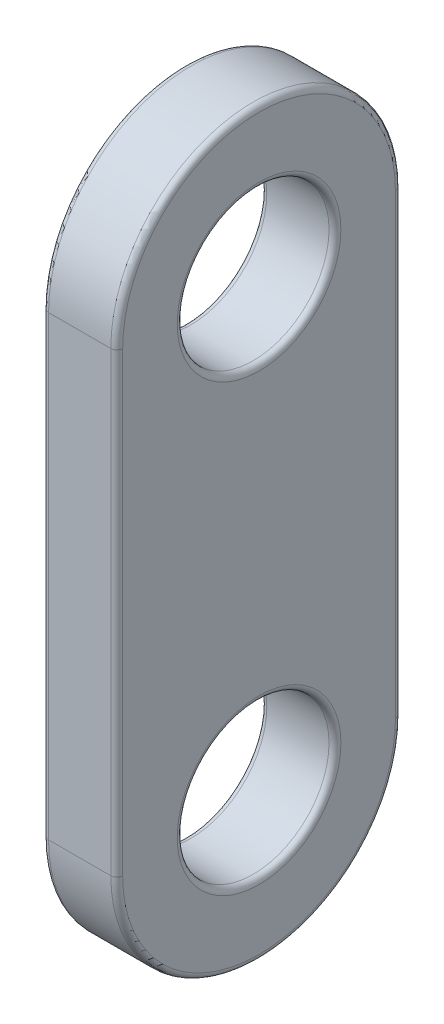
ISO-10303-21;
HEADER;
FILE_DESCRIPTION(('STEP AP214'),'2;1');
FILE_NAME('part.step','',(''),(''),'','','');
FILE_SCHEMA(('AUTOMOTIVE_DESIGN { 1 0 10303 214 1 1 1 1 }'));
ENDSEC;
DATA;
#1=APPLICATION_CONTEXT('core data for automotive mechanical design processes');
#2=APPLICATION_PROTOCOL_DEFINITION('international standard','automotive_design',2000,#1);
#3=PRODUCT_CONTEXT('',#1,'mechanical');
#4=PRODUCT('Part','Part','',(#3));
#5=PRODUCT_RELATED_PRODUCT_CATEGORY('part','',(#4));
#6=PRODUCT_DEFINITION_FORMATION('','',#4);
#7=PRODUCT_DEFINITION_CONTEXT('part definition',#1,'design');
#8=PRODUCT_DEFINITION('design','',#6,#7);
#9=PRODUCT_DEFINITION_SHAPE('','',#8);
#10=(LENGTH_UNIT() NAMED_UNIT(*) SI_UNIT(.MILLI.,.METRE.));
#11=(NAMED_UNIT(*) PLANE_ANGLE_UNIT() SI_UNIT($,.RADIAN.));
#12=(NAMED_UNIT(*) SI_UNIT($,.STERADIAN.) SOLID_ANGLE_UNIT());
#13=UNCERTAINTY_MEASURE_WITH_UNIT(LENGTH_MEASURE(1.E-05),#10,'distance_accuracy_value','');
#14=(GEOMETRIC_REPRESENTATION_CONTEXT(3) GLOBAL_UNCERTAINTY_ASSIGNED_CONTEXT((#13)) GLOBAL_UNIT_ASSIGNED_CONTEXT((#10,
#11,#12)) REPRESENTATION_CONTEXT('',''));
#15=CARTESIAN_POINT('',(0.,0.,0.));
#16=DIRECTION('',(0.,0.,1.));
#17=DIRECTION('',(1.,0.,0.));
#18=AXIS2_PLACEMENT_3D('',#15,#16,#17);
#19=CARTESIAN_POINT('',(-1.5875,-9.779,0.));
#20=DIRECTION('',(-1.,0.,0.));
#21=DIRECTION('',(0.,0.,1.));
#22=AXIS2_PLACEMENT_3D('',#19,#20,#21);
#23=CYLINDRICAL_SURFACE('',#22,6.096);
#24=DIRECTION('',(-1.,0.,0.));
#25=VECTOR('',#24,1.);
#26=CARTESIAN_POINT('',(1.5875,-9.779,6.096));
#27=LINE('',#26,#25);
#28=CARTESIAN_POINT('',(-1.3335,-9.779,6.096));
#29=VERTEX_POINT('',#28);
#30=CARTESIAN_POINT('',(1.3335,-9.779,6.096));
#31=VERTEX_POINT('',#30);
#32=EDGE_CURVE('E208',#29,#31,#27,.F.);
#33=ORIENTED_EDGE('',*,*,#32,.F.);
#34=CARTESIAN_POINT('',(-1.3335,-9.779,0.));
#35=DIRECTION('',(1.,0.,0.));
#36=DIRECTION('',(0.,0.,-1.));
#37=AXIS2_PLACEMENT_3D('',#34,#35,#36);
#38=CIRCLE('',#37,6.096);
#39=CARTESIAN_POINT('',(-1.3335,-9.779,-6.096));
#40=VERTEX_POINT('',#39);
#41=EDGE_CURVE('E11',#29,#40,#38,.T.);
#42=ORIENTED_EDGE('',*,*,#41,.T.);
#43=DIRECTION('',(-1.,0.,0.));
#44=VECTOR('',#43,1.);
#45=CARTESIAN_POINT('',(1.5875,-9.779,-6.096));
#46=LINE('',#45,#44);
#47=CARTESIAN_POINT('',(1.3335,-9.779,-6.096));
#48=VERTEX_POINT('',#47);
#49=EDGE_CURVE('E122',#48,#40,#46,.T.);
#50=ORIENTED_EDGE('',*,*,#49,.F.);
#51=CARTESIAN_POINT('',(1.3335,-9.779,0.));
#52=DIRECTION('',(1.,0.,0.));
#53=DIRECTION('',(0.,0.,-1.));
#54=AXIS2_PLACEMENT_3D('',#51,#52,#53);
#55=CIRCLE('',#54,6.096);
#56=EDGE_CURVE('E41',#48,#31,#55,.F.);
#57=ORIENTED_EDGE('',*,*,#56,.T.);
#58=EDGE_LOOP('',(#33,#42,#50,#57));
#59=FACE_BOUND('',#58,.T.);
#60=ADVANCED_FACE('F32',(#59),#23,.T.);
#61=CARTESIAN_POINT('',(1.5875,9.77900000000001,0.));
#62=DIRECTION('',(-1.,0.,0.));
#63=DIRECTION('',(0.,0.,1.));
#64=AXIS2_PLACEMENT_3D('',#61,#62,#63);
#65=CYLINDRICAL_SURFACE('',#64,6.096);
#66=DIRECTION('',(-1.,0.,0.));
#67=VECTOR('',#66,1.);
#68=CARTESIAN_POINT('',(1.5875,9.77900000000001,6.096));
#69=LINE('',#68,#67);
#70=CARTESIAN_POINT('',(1.3335,9.77900000000001,6.096));
#71=VERTEX_POINT('',#70);
#72=CARTESIAN_POINT('',(-1.3335,9.77900000000001,6.096));
#73=VERTEX_POINT('',#72);
#74=EDGE_CURVE('E179',#71,#73,#69,.T.);
#75=ORIENTED_EDGE('',*,*,#74,.F.);
#76=CARTESIAN_POINT('',(1.3335,9.77900000000001,0.));
#77=DIRECTION('',(1.,0.,0.));
#78=DIRECTION('',(0.,0.,-1.));
#79=AXIS2_PLACEMENT_3D('',#76,#77,#78);
#80=CIRCLE('',#79,6.096);
#81=CARTESIAN_POINT('',(1.3335,9.77900000000001,-6.096));
#82=VERTEX_POINT('',#81);
#83=EDGE_CURVE('E172',#71,#82,#80,.F.);
#84=ORIENTED_EDGE('',*,*,#83,.T.);
#85=DIRECTION('',(-1.,0.,0.));
#86=VECTOR('',#85,1.);
#87=CARTESIAN_POINT('',(1.5875,9.77900000000001,-6.096));
#88=LINE('',#87,#86);
#89=CARTESIAN_POINT('',(-1.3335,9.77900000000001,-6.096));
#90=VERTEX_POINT('',#89);
#91=EDGE_CURVE('E202',#90,#82,#88,.F.);
#92=ORIENTED_EDGE('',*,*,#91,.F.);
#93=CARTESIAN_POINT('',(-1.3335,9.77900000000001,0.));
#94=DIRECTION('',(1.,0.,0.));
#95=DIRECTION('',(0.,0.,-1.));
#96=AXIS2_PLACEMENT_3D('',#93,#94,#95);
#97=CIRCLE('',#96,6.096);
#98=EDGE_CURVE('E49',#90,#73,#97,.T.);
#99=ORIENTED_EDGE('',*,*,#98,.T.);
#100=EDGE_LOOP('',(#75,#84,#92,#99));
#101=FACE_BOUND('',#100,.T.);
#102=ADVANCED_FACE('F201',(#101),#65,.T.);
#103=CARTESIAN_POINT('',(1.5875,0.,0.));
#104=DIRECTION('',(1.,0.,0.));
#105=DIRECTION('',(0.,0.,-1.));
#106=AXIS2_PLACEMENT_3D('',#103,#104,#105);
#107=PLANE('',#106);
#108=CARTESIAN_POINT('',(1.5875,-9.525,0.));
#109=DIRECTION('',(1.,0.,0.));
#110=DIRECTION('',(0.,0.,-1.));
#111=AXIS2_PLACEMENT_3D('',#108,#109,#110);
#112=CIRCLE('',#111,3.5052);
#113=CARTESIAN_POINT('',(1.5875,-9.525,-3.5052));
#114=VERTEX_POINT('',#113);
#115=EDGE_CURVE('E155',#114,#114,#112,.F.);
#116=ORIENTED_EDGE('',*,*,#115,.T.);
#117=EDGE_LOOP('',(#116));
#118=FACE_BOUND('',#117,.T.);
#119=CARTESIAN_POINT('',(1.5875,9.525,0.));
#120=DIRECTION('',(1.,0.,0.));
#121=DIRECTION('',(0.,0.,-1.));
#122=AXIS2_PLACEMENT_3D('',#119,#120,#121);
#123=CIRCLE('',#122,3.5052);
#124=CARTESIAN_POINT('',(1.5875,9.525,-3.5052));
#125=VERTEX_POINT('',#124);
#126=EDGE_CURVE('E152',#125,#125,#123,.F.);
#127=ORIENTED_EDGE('',*,*,#126,.T.);
#128=EDGE_LOOP('',(#127));
#129=FACE_BOUND('',#128,.T.);
#130=CARTESIAN_POINT('',(1.5875,-9.779,0.));
#131=DIRECTION('',(1.,0.,0.));
#132=DIRECTION('',(0.,0.,-1.));
#133=AXIS2_PLACEMENT_3D('',#130,#131,#132);
#134=CIRCLE('',#133,5.842);
#135=CARTESIAN_POINT('',(1.5875,-9.779,5.842));
#136=VERTEX_POINT('',#135);
#137=CARTESIAN_POINT('',(1.5875,-9.779,-5.842));
#138=VERTEX_POINT('',#137);
#139=EDGE_CURVE('E145',#136,#138,#134,.T.);
#140=ORIENTED_EDGE('',*,*,#139,.T.);
#141=DIRECTION('',(0.,1.,0.));
#142=VECTOR('',#141,1.);
#143=CARTESIAN_POINT('',(1.5875,9.77900000000001,-5.842));
#144=LINE('',#143,#142);
#145=CARTESIAN_POINT('',(1.5875,9.77900000000001,-5.842));
#146=VERTEX_POINT('',#145);
#147=EDGE_CURVE('E149',#138,#146,#144,.T.);
#148=ORIENTED_EDGE('',*,*,#147,.T.);
#149=CARTESIAN_POINT('',(1.5875,9.77900000000001,0.));
#150=DIRECTION('',(1.,0.,0.));
#151=DIRECTION('',(0.,0.,-1.));
#152=AXIS2_PLACEMENT_3D('',#149,#150,#151);
#153=CIRCLE('',#152,5.842);
#154=CARTESIAN_POINT('',(1.5875,9.77900000000001,5.842));
#155=VERTEX_POINT('',#154);
#156=EDGE_CURVE('E147',#146,#155,#153,.T.);
#157=ORIENTED_EDGE('',*,*,#156,.T.);
#158=DIRECTION('',(0.,-1.,0.));
#159=VECTOR('',#158,1.);
#160=CARTESIAN_POINT('',(1.5875,-9.779,5.842));
#161=LINE('',#160,#159);
#162=EDGE_CURVE('E143',#155,#136,#161,.T.);
#163=ORIENTED_EDGE('',*,*,#162,.T.);
#164=EDGE_LOOP('',(#140,#148,#157,#163));
#165=FACE_BOUND('',#164,.T.);
#166=ADVANCED_FACE('F214',(#118,#129,#165),#107,.T.);
#167=CARTESIAN_POINT('',(-1.5875,0.,0.));
#168=DIRECTION('',(1.,0.,0.));
#169=DIRECTION('',(0.,0.,-1.));
#170=AXIS2_PLACEMENT_3D('',#167,#168,#169);
#171=PLANE('',#170);
#172=CARTESIAN_POINT('',(-1.5875,-9.525,0.));
#173=DIRECTION('',(1.,0.,0.));
#174=DIRECTION('',(0.,0.,-1.));
#175=AXIS2_PLACEMENT_3D('',#172,#173,#174);
#176=CIRCLE('',#175,3.5052);
#177=CARTESIAN_POINT('',(-1.5875,-9.525,-3.5052));
#178=VERTEX_POINT('',#177);
#179=EDGE_CURVE('E134',#178,#178,#176,.T.);
#180=ORIENTED_EDGE('',*,*,#179,.T.);
#181=EDGE_LOOP('',(#180));
#182=FACE_BOUND('',#181,.T.);
#183=CARTESIAN_POINT('',(-1.5875,9.525,0.));
#184=DIRECTION('',(1.,0.,0.));
#185=DIRECTION('',(0.,0.,-1.));
#186=AXIS2_PLACEMENT_3D('',#183,#184,#185);
#187=CIRCLE('',#186,3.5052);
#188=CARTESIAN_POINT('',(-1.5875,9.525,-3.5052));
#189=VERTEX_POINT('',#188);
#190=EDGE_CURVE('E128',#189,#189,#187,.T.);
#191=ORIENTED_EDGE('',*,*,#190,.T.);
#192=EDGE_LOOP('',(#191));
#193=FACE_BOUND('',#192,.T.);
#194=DIRECTION('',(0.,-1.,0.));
#195=VECTOR('',#194,1.);
#196=CARTESIAN_POINT('',(-1.5875,0.,5.842));
#197=LINE('',#196,#195);
#198=CARTESIAN_POINT('',(-1.5875,-9.779,5.842));
#199=VERTEX_POINT('',#198);
#200=CARTESIAN_POINT('',(-1.5875,9.77900000000001,5.842));
#201=VERTEX_POINT('',#200);
#202=EDGE_CURVE('E121',#199,#201,#197,.F.);
#203=ORIENTED_EDGE('',*,*,#202,.T.);
#204=CARTESIAN_POINT('',(-1.5875,9.77900000000001,0.));
#205=DIRECTION('',(1.,0.,0.));
#206=DIRECTION('',(0.,0.,-1.));
#207=AXIS2_PLACEMENT_3D('',#204,#205,#206);
#208=CIRCLE('',#207,5.842);
#209=CARTESIAN_POINT('',(-1.5875,9.77900000000001,-5.842));
#210=VERTEX_POINT('',#209);
#211=EDGE_CURVE('E126',#201,#210,#208,.F.);
#212=ORIENTED_EDGE('',*,*,#211,.T.);
#213=DIRECTION('',(0.,1.,0.));
#214=VECTOR('',#213,1.);
#215=CARTESIAN_POINT('',(-1.5875,0.,-5.842));
#216=LINE('',#215,#214);
#217=CARTESIAN_POINT('',(-1.5875,-9.779,-5.842));
#218=VERTEX_POINT('',#217);
#219=EDGE_CURVE('E105',#210,#218,#216,.F.);
#220=ORIENTED_EDGE('',*,*,#219,.T.);
#221=CARTESIAN_POINT('',(-1.5875,-9.779,0.));
#222=DIRECTION('',(1.,0.,0.));
#223=DIRECTION('',(0.,0.,-1.));
#224=AXIS2_PLACEMENT_3D('',#221,#222,#223);
#225=CIRCLE('',#224,5.842);
#226=EDGE_CURVE('E115',#218,#199,#225,.F.);
#227=ORIENTED_EDGE('',*,*,#226,.T.);
#228=EDGE_LOOP('',(#203,#212,#220,#227));
#229=FACE_BOUND('',#228,.T.);
#230=ADVANCED_FACE('F124',(#182,#193,#229),#171,.F.);
#231=CARTESIAN_POINT('',(1.5875,15.875,-6.096));
#232=DIRECTION('',(0.,0.,1.));
#233=DIRECTION('',(0.,-1.,0.));
#234=AXIS2_PLACEMENT_3D('',#231,#232,#233);
#235=PLANE('',#234);
#236=ORIENTED_EDGE('',*,*,#49,.T.);
#237=DIRECTION('',(0.,1.,0.));
#238=VECTOR('',#237,1.);
#239=CARTESIAN_POINT('',(-1.3335,15.875,-6.096));
#240=LINE('',#239,#238);
#241=EDGE_CURVE('E108',#40,#90,#240,.T.);
#242=ORIENTED_EDGE('',*,*,#241,.T.);
#243=ORIENTED_EDGE('',*,*,#91,.T.);
#244=DIRECTION('',(0.,1.,0.));
#245=VECTOR('',#244,1.);
#246=CARTESIAN_POINT('',(1.3335,-9.77899999999999,-6.096));
#247=LINE('',#246,#245);
#248=EDGE_CURVE('E164',#82,#48,#247,.F.);
#249=ORIENTED_EDGE('',*,*,#248,.T.);
#250=EDGE_LOOP('',(#236,#242,#243,#249));
#251=FACE_BOUND('',#250,.T.);
#252=ADVANCED_FACE('F206',(#251),#235,.F.);
#253=CARTESIAN_POINT('',(1.5875,15.875,6.096));
#254=DIRECTION('',(0.,0.,-1.));
#255=DIRECTION('',(0.,1.,0.));
#256=AXIS2_PLACEMENT_3D('',#253,#254,#255);
#257=PLANE('',#256);
#258=ORIENTED_EDGE('',*,*,#74,.T.);
#259=DIRECTION('',(0.,-1.,0.));
#260=VECTOR('',#259,1.);
#261=CARTESIAN_POINT('',(-1.3335,15.875,6.096));
#262=LINE('',#261,#260);
#263=EDGE_CURVE('E169',#73,#29,#262,.T.);
#264=ORIENTED_EDGE('',*,*,#263,.T.);
#265=ORIENTED_EDGE('',*,*,#32,.T.);
#266=DIRECTION('',(0.,-1.,0.));
#267=VECTOR('',#266,1.);
#268=CARTESIAN_POINT('',(1.3335,9.77900000000001,6.096));
#269=LINE('',#268,#267);
#270=EDGE_CURVE('E56',#31,#71,#269,.F.);
#271=ORIENTED_EDGE('',*,*,#270,.T.);
#272=EDGE_LOOP('',(#258,#264,#265,#271));
#273=FACE_BOUND('',#272,.T.);
#274=ADVANCED_FACE('F319',(#273),#257,.F.);
#275=CARTESIAN_POINT('',(1.5875,9.525,0.));
#276=DIRECTION('',(-1.,0.,0.));
#277=DIRECTION('',(0.,0.,1.));
#278=AXIS2_PLACEMENT_3D('',#275,#276,#277);
#279=CYLINDRICAL_SURFACE('',#278,3.2512);
#280=CARTESIAN_POINT('',(-1.3335,9.525,0.));
#281=DIRECTION('',(1.,0.,0.));
#282=DIRECTION('',(0.,0.,-1.));
#283=AXIS2_PLACEMENT_3D('',#280,#281,#282);
#284=CIRCLE('',#283,3.2512);
#285=CARTESIAN_POINT('',(-1.3335,9.525,-3.2512));
#286=VERTEX_POINT('',#285);
#287=EDGE_CURVE('E161',#286,#286,#284,.F.);
#288=ORIENTED_EDGE('',*,*,#287,.T.);
#289=EDGE_LOOP('',(#288));
#290=FACE_BOUND('',#289,.T.);
#291=CARTESIAN_POINT('',(1.3335,9.525,0.));
#292=DIRECTION('',(1.,0.,0.));
#293=DIRECTION('',(0.,0.,-1.));
#294=AXIS2_PLACEMENT_3D('',#291,#292,#293);
#295=CIRCLE('',#294,3.2512);
#296=CARTESIAN_POINT('',(1.3335,9.525,-3.2512));
#297=VERTEX_POINT('',#296);
#298=EDGE_CURVE('E158',#297,#297,#295,.T.);
#299=ORIENTED_EDGE('',*,*,#298,.T.);
#300=EDGE_LOOP('',(#299));
#301=FACE_BOUND('',#300,.T.);
#302=ADVANCED_FACE('F311',(#290,#301),#279,.F.);
#303=CARTESIAN_POINT('',(1.5875,-9.525,0.));
#304=DIRECTION('',(-1.,0.,0.));
#305=DIRECTION('',(0.,0.,1.));
#306=AXIS2_PLACEMENT_3D('',#303,#304,#305);
#307=CYLINDRICAL_SURFACE('',#306,3.2512);
#308=CARTESIAN_POINT('',(-1.3335,-9.525,0.));
#309=DIRECTION('',(1.,0.,0.));
#310=DIRECTION('',(0.,0.,-1.));
#311=AXIS2_PLACEMENT_3D('',#308,#309,#310);
#312=CIRCLE('',#311,3.2512);
#313=CARTESIAN_POINT('',(-1.3335,-9.525,-3.2512));
#314=VERTEX_POINT('',#313);
#315=EDGE_CURVE('E140',#314,#314,#312,.F.);
#316=ORIENTED_EDGE('',*,*,#315,.T.);
#317=EDGE_LOOP('',(#316));
#318=FACE_BOUND('',#317,.T.);
#319=CARTESIAN_POINT('',(1.3335,-9.525,0.));
#320=DIRECTION('',(1.,0.,0.));
#321=DIRECTION('',(0.,0.,-1.));
#322=AXIS2_PLACEMENT_3D('',#319,#320,#321);
#323=CIRCLE('',#322,3.2512);
#324=CARTESIAN_POINT('',(1.3335,-9.525,-3.2512));
#325=VERTEX_POINT('',#324);
#326=EDGE_CURVE('E137',#325,#325,#323,.T.);
#327=ORIENTED_EDGE('',*,*,#326,.T.);
#328=EDGE_LOOP('',(#327));
#329=FACE_BOUND('',#328,.T.);
#330=ADVANCED_FACE('F239',(#318,#329),#307,.F.);
#331=CARTESIAN_POINT('',(-1.3335,-9.525,0.));
#332=DIRECTION('',(1.,0.,0.));
#333=DIRECTION('',(0.,0.,-1.));
#334=AXIS2_PLACEMENT_3D('',#331,#332,#333);
#335=TOROIDAL_SURFACE('',#334,3.5052,0.254);
#336=ORIENTED_EDGE('',*,*,#315,.F.);
#337=EDGE_LOOP('',(#336));
#338=FACE_BOUND('',#337,.T.);
#339=ORIENTED_EDGE('',*,*,#179,.F.);
#340=EDGE_LOOP('',(#339));
#341=FACE_BOUND('',#340,.T.);
#342=ADVANCED_FACE('F235',(#338,#341),#335,.T.);
#343=CARTESIAN_POINT('',(1.3335,-9.525,0.));
#344=DIRECTION('',(1.,0.,0.));
#345=DIRECTION('',(0.,0.,-1.));
#346=AXIS2_PLACEMENT_3D('',#343,#344,#345);
#347=TOROIDAL_SURFACE('',#346,3.5052,0.254);
#348=ORIENTED_EDGE('',*,*,#115,.F.);
#349=EDGE_LOOP('',(#348));
#350=FACE_BOUND('',#349,.T.);
#351=ORIENTED_EDGE('',*,*,#326,.F.);
#352=EDGE_LOOP('',(#351));
#353=FACE_BOUND('',#352,.T.);
#354=ADVANCED_FACE('F238',(#350,#353),#347,.T.);
#355=CARTESIAN_POINT('',(-1.3335,9.525,0.));
#356=DIRECTION('',(1.,0.,0.));
#357=DIRECTION('',(0.,0.,-1.));
#358=AXIS2_PLACEMENT_3D('',#355,#356,#357);
#359=TOROIDAL_SURFACE('',#358,3.5052,0.254);
#360=ORIENTED_EDGE('',*,*,#287,.F.);
#361=EDGE_LOOP('',(#360));
#362=FACE_BOUND('',#361,.T.);
#363=ORIENTED_EDGE('',*,*,#190,.F.);
#364=EDGE_LOOP('',(#363));
#365=FACE_BOUND('',#364,.T.);
#366=ADVANCED_FACE('F243',(#362,#365),#359,.T.);
#367=CARTESIAN_POINT('',(1.3335,9.525,0.));
#368=DIRECTION('',(1.,0.,0.));
#369=DIRECTION('',(0.,0.,-1.));
#370=AXIS2_PLACEMENT_3D('',#367,#368,#369);
#371=TOROIDAL_SURFACE('',#370,3.5052,0.254);
#372=ORIENTED_EDGE('',*,*,#126,.F.);
#373=EDGE_LOOP('',(#372));
#374=FACE_BOUND('',#373,.T.);
#375=ORIENTED_EDGE('',*,*,#298,.F.);
#376=EDGE_LOOP('',(#375));
#377=FACE_BOUND('',#376,.T.);
#378=ADVANCED_FACE('F247',(#374,#377),#371,.T.);
#379=CARTESIAN_POINT('',(-1.3335,15.875,5.842));
#380=DIRECTION('',(0.,-1.,0.));
#381=DIRECTION('',(0.,0.,-1.));
#382=AXIS2_PLACEMENT_3D('',#379,#380,#381);
#383=CYLINDRICAL_SURFACE('',#382,0.254);
#384=CARTESIAN_POINT('',(-1.3335,9.77900000000001,5.842));
#385=DIRECTION('',(0.,1.,0.));
#386=DIRECTION('',(0.,0.,1.));
#387=AXIS2_PLACEMENT_3D('',#384,#385,#386);
#388=CIRCLE('',#387,0.254);
#389=EDGE_CURVE('E111',#201,#73,#388,.T.);
#390=ORIENTED_EDGE('',*,*,#389,.F.);
#391=ORIENTED_EDGE('',*,*,#202,.F.);
#392=CARTESIAN_POINT('',(-1.3335,-9.779,5.842));
#393=DIRECTION('',(0.,-1.,0.));
#394=DIRECTION('',(0.,0.,-1.));
#395=AXIS2_PLACEMENT_3D('',#392,#393,#394);
#396=CIRCLE('',#395,0.254);
#397=EDGE_CURVE('E118',#29,#199,#396,.T.);
#398=ORIENTED_EDGE('',*,*,#397,.F.);
#399=ORIENTED_EDGE('',*,*,#263,.F.);
#400=EDGE_LOOP('',(#390,#391,#398,#399));
#401=FACE_BOUND('',#400,.T.);
#402=ADVANCED_FACE('F251',(#401),#383,.T.);
#403=CARTESIAN_POINT('',(-1.3335,-9.779,0.));
#404=DIRECTION('',(1.,0.,0.));
#405=DIRECTION('',(0.,0.,-1.));
#406=AXIS2_PLACEMENT_3D('',#403,#404,#405);
#407=TOROIDAL_SURFACE('',#406,5.842,0.254);
#408=ORIENTED_EDGE('',*,*,#397,.T.);
#409=ORIENTED_EDGE('',*,*,#226,.F.);
#410=CARTESIAN_POINT('',(-1.3335,-9.779,-5.842));
#411=DIRECTION('',(0.,1.,0.));
#412=DIRECTION('',(0.,0.,1.));
#413=AXIS2_PLACEMENT_3D('',#410,#411,#412);
#414=CIRCLE('',#413,0.254);
#415=EDGE_CURVE('E101',#40,#218,#414,.T.);
#416=ORIENTED_EDGE('',*,*,#415,.F.);
#417=ORIENTED_EDGE('',*,*,#41,.F.);
#418=EDGE_LOOP('',(#408,#409,#416,#417));
#419=FACE_BOUND('',#418,.T.);
#420=ADVANCED_FACE('F116',(#419),#407,.T.);
#421=CARTESIAN_POINT('',(-1.3335,9.77900000000001,0.));
#422=DIRECTION('',(1.,0.,0.));
#423=DIRECTION('',(0.,0.,-1.));
#424=AXIS2_PLACEMENT_3D('',#421,#422,#423);
#425=TOROIDAL_SURFACE('',#424,5.842,0.254);
#426=ORIENTED_EDGE('',*,*,#389,.T.);
#427=ORIENTED_EDGE('',*,*,#98,.F.);
#428=CARTESIAN_POINT('',(-1.3335,9.77900000000001,-5.842));
#429=DIRECTION('',(0.,-1.,0.));
#430=DIRECTION('',(0.,0.,-1.));
#431=AXIS2_PLACEMENT_3D('',#428,#429,#430);
#432=CIRCLE('',#431,0.254);
#433=EDGE_CURVE('E112',#210,#90,#432,.T.);
#434=ORIENTED_EDGE('',*,*,#433,.F.);
#435=ORIENTED_EDGE('',*,*,#211,.F.);
#436=EDGE_LOOP('',(#426,#427,#434,#435));
#437=FACE_BOUND('',#436,.T.);
#438=ADVANCED_FACE('F255',(#437),#425,.T.);
#439=CARTESIAN_POINT('',(-1.3335,15.875,-5.842));
#440=DIRECTION('',(0.,1.,0.));
#441=DIRECTION('',(0.,0.,1.));
#442=AXIS2_PLACEMENT_3D('',#439,#440,#441);
#443=CYLINDRICAL_SURFACE('',#442,0.254);
#444=ORIENTED_EDGE('',*,*,#415,.T.);
#445=ORIENTED_EDGE('',*,*,#219,.F.);
#446=ORIENTED_EDGE('',*,*,#433,.T.);
#447=ORIENTED_EDGE('',*,*,#241,.F.);
#448=EDGE_LOOP('',(#444,#445,#446,#447));
#449=FACE_BOUND('',#448,.T.);
#450=ADVANCED_FACE('F103',(#449),#443,.T.);
#451=CARTESIAN_POINT('',(1.3335,0.,5.842));
#452=DIRECTION('',(0.,1.,0.));
#453=DIRECTION('',(0.,0.,1.));
#454=AXIS2_PLACEMENT_3D('',#451,#452,#453);
#455=CYLINDRICAL_SURFACE('',#454,0.254);
#456=CARTESIAN_POINT('',(1.3335,9.77900000000001,5.842));
#457=DIRECTION('',(0.,1.,0.));
#458=DIRECTION('',(0.,0.,1.));
#459=AXIS2_PLACEMENT_3D('',#456,#457,#458);
#460=CIRCLE('',#459,0.254);
#461=EDGE_CURVE('E183',#71,#155,#460,.T.);
#462=ORIENTED_EDGE('',*,*,#461,.F.);
#463=ORIENTED_EDGE('',*,*,#270,.F.);
#464=CARTESIAN_POINT('',(1.3335,-9.779,5.842));
#465=DIRECTION('',(0.,-1.,0.));
#466=DIRECTION('',(0.,0.,-1.));
#467=AXIS2_PLACEMENT_3D('',#464,#465,#466);
#468=CIRCLE('',#467,0.254);
#469=EDGE_CURVE('E36',#136,#31,#468,.T.);
#470=ORIENTED_EDGE('',*,*,#469,.F.);
#471=ORIENTED_EDGE('',*,*,#162,.F.);
#472=EDGE_LOOP('',(#462,#463,#470,#471));
#473=FACE_BOUND('',#472,.T.);
#474=ADVANCED_FACE('F34',(#473),#455,.T.);
#475=CARTESIAN_POINT('',(1.3335,-9.779,0.));
#476=DIRECTION('',(1.,0.,0.));
#477=DIRECTION('',(0.,0.,-1.));
#478=AXIS2_PLACEMENT_3D('',#475,#476,#477);
#479=TOROIDAL_SURFACE('',#478,5.842,0.254);
#480=ORIENTED_EDGE('',*,*,#469,.T.);
#481=ORIENTED_EDGE('',*,*,#56,.F.);
#482=CARTESIAN_POINT('',(1.3335,-9.779,-5.842));
#483=DIRECTION('',(0.,1.,0.));
#484=DIRECTION('',(0.,0.,1.));
#485=AXIS2_PLACEMENT_3D('',#482,#483,#484);
#486=CIRCLE('',#485,0.254);
#487=EDGE_CURVE('E182',#138,#48,#486,.T.);
#488=ORIENTED_EDGE('',*,*,#487,.F.);
#489=ORIENTED_EDGE('',*,*,#139,.F.);
#490=EDGE_LOOP('',(#480,#481,#488,#489));
#491=FACE_BOUND('',#490,.T.);
#492=ADVANCED_FACE('F194',(#491),#479,.T.);
#493=CARTESIAN_POINT('',(1.3335,9.77900000000001,0.));
#494=DIRECTION('',(1.,0.,0.));
#495=DIRECTION('',(0.,0.,-1.));
#496=AXIS2_PLACEMENT_3D('',#493,#494,#495);
#497=TOROIDAL_SURFACE('',#496,5.842,0.254);
#498=ORIENTED_EDGE('',*,*,#461,.T.);
#499=ORIENTED_EDGE('',*,*,#156,.F.);
#500=CARTESIAN_POINT('',(1.3335,9.77900000000001,-5.842));
#501=DIRECTION('',(0.,-1.,0.));
#502=DIRECTION('',(0.,0.,-1.));
#503=AXIS2_PLACEMENT_3D('',#500,#501,#502);
#504=CIRCLE('',#503,0.254);
#505=EDGE_CURVE('E180',#82,#146,#504,.T.);
#506=ORIENTED_EDGE('',*,*,#505,.F.);
#507=ORIENTED_EDGE('',*,*,#83,.F.);
#508=EDGE_LOOP('',(#498,#499,#506,#507));
#509=FACE_BOUND('',#508,.T.);
#510=ADVANCED_FACE('F199',(#509),#497,.T.);
#511=CARTESIAN_POINT('',(1.3335,0.,-5.842));
#512=DIRECTION('',(0.,-1.,0.));
#513=DIRECTION('',(0.,0.,-1.));
#514=AXIS2_PLACEMENT_3D('',#511,#512,#513);
#515=CYLINDRICAL_SURFACE('',#514,0.254);
#516=ORIENTED_EDGE('',*,*,#487,.T.);
#517=ORIENTED_EDGE('',*,*,#248,.F.);
#518=ORIENTED_EDGE('',*,*,#505,.T.);
#519=ORIENTED_EDGE('',*,*,#147,.F.);
#520=EDGE_LOOP('',(#516,#517,#518,#519));
#521=FACE_BOUND('',#520,.T.);
#522=ADVANCED_FACE('F211',(#521),#515,.T.);
#523=CLOSED_SHELL('',(#60,#102,#166,#230,#252,#274,#302,#330,#342,#354,#366,#378,#402,#420,#438,
#450,#474,#492,#510,#522));
#524=MANIFOLD_SOLID_BREP('B2',#523);
#525=ADVANCED_BREP_SHAPE_REPRESENTATION('',(#18,#524),#14);
#526=SHAPE_DEFINITION_REPRESENTATION(#9,#525);
ENDSEC;
END-ISO-10303-21;
